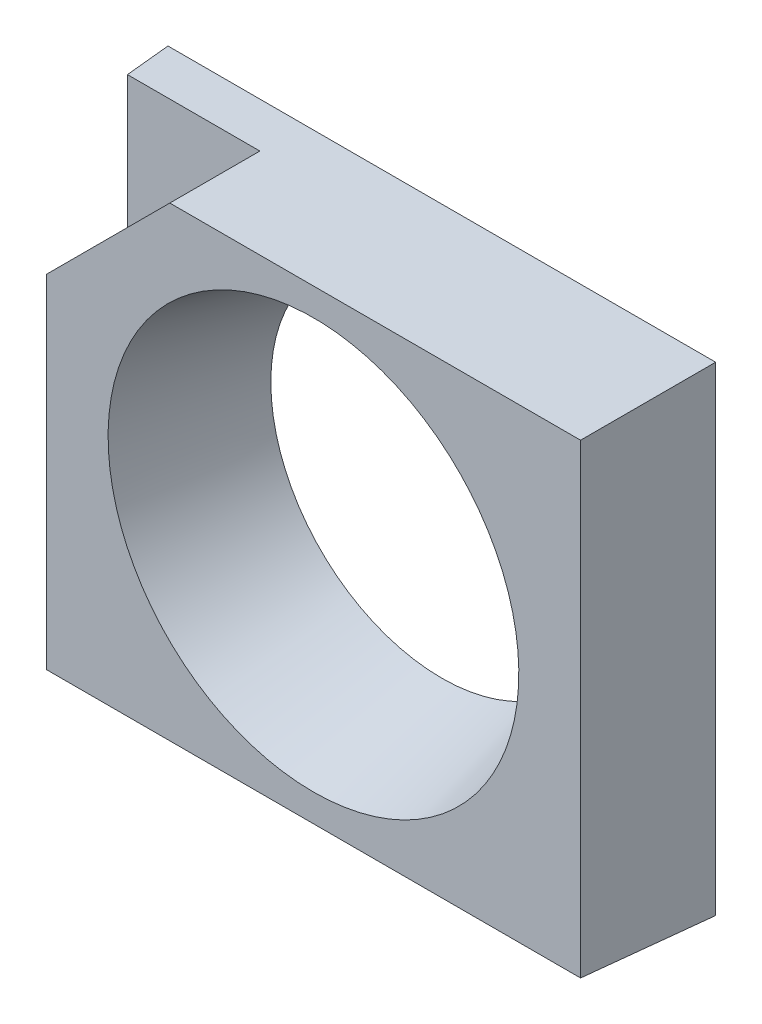
ISO-10303-21;
HEADER;
FILE_DESCRIPTION(('STEP AP214'),'2;1');
FILE_NAME('part.step','',(''),(''),'','','');
FILE_SCHEMA(('AUTOMOTIVE_DESIGN { 1 0 10303 214 1 1 1 1 }'));
ENDSEC;
DATA;
#1=APPLICATION_CONTEXT('core data for automotive mechanical design processes');
#2=APPLICATION_PROTOCOL_DEFINITION('international standard','automotive_design',2000,#1);
#3=PRODUCT_CONTEXT('',#1,'mechanical');
#4=PRODUCT('Part','Part','',(#3));
#5=PRODUCT_RELATED_PRODUCT_CATEGORY('part','',(#4));
#6=PRODUCT_DEFINITION_FORMATION('','',#4);
#7=PRODUCT_DEFINITION_CONTEXT('part definition',#1,'design');
#8=PRODUCT_DEFINITION('design','',#6,#7);
#9=PRODUCT_DEFINITION_SHAPE('','',#8);
#10=(LENGTH_UNIT() NAMED_UNIT(*) SI_UNIT(.MILLI.,.METRE.));
#11=(NAMED_UNIT(*) PLANE_ANGLE_UNIT() SI_UNIT($,.RADIAN.));
#12=(NAMED_UNIT(*) SI_UNIT($,.STERADIAN.) SOLID_ANGLE_UNIT());
#13=UNCERTAINTY_MEASURE_WITH_UNIT(LENGTH_MEASURE(1.E-05),#10,'distance_accuracy_value','');
#14=(GEOMETRIC_REPRESENTATION_CONTEXT(3) GLOBAL_UNCERTAINTY_ASSIGNED_CONTEXT((#13)) GLOBAL_UNIT_ASSIGNED_CONTEXT((#10,
#11,#12)) REPRESENTATION_CONTEXT('',''));
#15=CARTESIAN_POINT('',(0.,0.,0.));
#16=DIRECTION('',(0.,0.,1.));
#17=DIRECTION('',(1.,0.,0.));
#18=AXIS2_PLACEMENT_3D('',#15,#16,#17);
#19=CARTESIAN_POINT('',(-0.8,1.4,1.4));
#20=DIRECTION('',(-0.707106781186548,0.707106781186548,0.));
#21=DIRECTION('',(-0.707106781186548,-0.707106781186548,0.));
#22=AXIS2_PLACEMENT_3D('',#19,#20,#21);
#23=PLANE('',#22);
#24=DIRECTION('',(-0.0522644276876815,-0.0522644276886907,0.997264688634293));
#25=VECTOR('',#24,1.);
#26=CARTESIAN_POINT('',(-0.813101944821,1.38689805517925,1.40000000000001));
#27=LINE('',#26,#25);
#28=CARTESIAN_POINT('',(-0.813101944821,1.38689805517906,1.4));
#29=VERTEX_POINT('',#28);
#30=CARTESIAN_POINT('',(-0.839305834462,1.36069416553793,1.9));
#31=VERTEX_POINT('',#30);
#32=EDGE_CURVE('E66',#29,#31,#27,.T.);
#33=ORIENTED_EDGE('',*,*,#32,.F.);
#34=DIRECTION('',(-0.707106781186547,-0.707106781186547,0.));
#35=VECTOR('',#34,1.);
#36=CARTESIAN_POINT('',(-0.813101944821,1.386898055179,1.4));
#37=LINE('',#36,#35);
#38=CARTESIAN_POINT('',(-1.58689805517906,0.613101944821,1.4));
#39=VERTEX_POINT('',#38);
#40=EDGE_CURVE('E85',#29,#39,#37,.T.);
#41=ORIENTED_EDGE('',*,*,#40,.T.);
#42=DIRECTION('',(-0.0522644276886907,-0.0522644276876812,-0.997264688634293));
#43=VECTOR('',#42,1.);
#44=CARTESIAN_POINT('',(-1.56069416553774,0.639305834462,1.89999999999999));
#45=LINE('',#44,#43);
#46=CARTESIAN_POINT('',(-1.56069416553794,0.639305834462,1.9));
#47=VERTEX_POINT('',#46);
#48=EDGE_CURVE('E80',#47,#39,#45,.T.);
#49=ORIENTED_EDGE('',*,*,#48,.F.);
#50=DIRECTION('',(-0.707106781186547,-0.707106781186548,0.));
#51=VECTOR('',#50,1.);
#52=CARTESIAN_POINT('',(-0.839305834462,1.360694165538,1.9));
#53=LINE('',#52,#51);
#54=EDGE_CURVE('E79',#31,#47,#53,.T.);
#55=ORIENTED_EDGE('',*,*,#54,.F.);
#56=EDGE_LOOP('',(#33,#41,#49,#55));
#57=FACE_BOUND('',#56,.T.);
#58=ADVANCED_FACE('F17',(#57),#23,.T.);
#59=CARTESIAN_POINT('',(-1.6,0.6,1.4));
#60=DIRECTION('',(0.,0.,-1.));
#61=DIRECTION('',(-1.,0.,0.));
#62=AXIS2_PLACEMENT_3D('',#59,#60,#61);
#63=PLANE('',#62);
#64=DIRECTION('',(1.,0.,0.));
#65=VECTOR('',#64,1.);
#66=CARTESIAN_POINT('',(0.,1.38689805517925,1.40000000000001));
#67=LINE('',#66,#65);
#68=CARTESIAN_POINT('',(-1.58689805517906,1.38689805517906,1.40000000000001));
#69=VERTEX_POINT('',#68);
#70=EDGE_CURVE('E73',#69,#29,#67,.T.);
#71=ORIENTED_EDGE('',*,*,#70,.F.);
#72=DIRECTION('',(0.,1.,0.));
#73=VECTOR('',#72,1.);
#74=CARTESIAN_POINT('',(-1.58689805517925,0.,1.40000000000001));
#75=LINE('',#74,#73);
#76=EDGE_CURVE('E103',#39,#69,#75,.T.);
#77=ORIENTED_EDGE('',*,*,#76,.F.);
#78=ORIENTED_EDGE('',*,*,#40,.F.);
#79=EDGE_LOOP('',(#71,#77,#78));
#80=FACE_BOUND('',#79,.T.);
#81=ADVANCED_FACE('F104',(#80),#63,.F.);
#82=CARTESIAN_POINT('',(-1.6,-1.4,1.9));
#83=DIRECTION('',(0.,0.,1.));
#84=DIRECTION('',(1.,0.,0.));
#85=AXIS2_PLACEMENT_3D('',#82,#83,#84);
#86=PLANE('',#85);
#87=DIRECTION('',(1.,0.,0.));
#88=VECTOR('',#87,1.);
#89=CARTESIAN_POINT('',(0.,-1.36069416553774,1.89999999999999));
#90=LINE('',#89,#88);
#91=CARTESIAN_POINT('',(1.56069416553793,-1.36069416553793,1.89999999999999));
#92=VERTEX_POINT('',#91);
#93=CARTESIAN_POINT('',(-1.56069416553793,-1.36069416553787,1.89999999999999));
#94=VERTEX_POINT('',#93);
#95=EDGE_CURVE('E84',#92,#94,#90,.F.);
#96=ORIENTED_EDGE('',*,*,#95,.F.);
#97=DIRECTION('',(0.,1.,0.));
#98=VECTOR('',#97,1.);
#99=CARTESIAN_POINT('',(1.56069416553774,0.,1.89999999999999));
#100=LINE('',#99,#98);
#101=CARTESIAN_POINT('',(1.56069416553793,1.36069416553793,1.89999999999999));
#102=VERTEX_POINT('',#101);
#103=EDGE_CURVE('E91',#102,#92,#100,.F.);
#104=ORIENTED_EDGE('',*,*,#103,.F.);
#105=DIRECTION('',(1.,0.,0.));
#106=VECTOR('',#105,1.);
#107=CARTESIAN_POINT('',(0.,1.36069416553774,1.89999999999999));
#108=LINE('',#107,#106);
#109=EDGE_CURVE('E70',#31,#102,#108,.T.);
#110=ORIENTED_EDGE('',*,*,#109,.F.);
#111=ORIENTED_EDGE('',*,*,#54,.T.);
#112=DIRECTION('',(0.,1.,0.));
#113=VECTOR('',#112,1.);
#114=CARTESIAN_POINT('',(-1.56069416553774,0.,1.89999999999999));
#115=LINE('',#114,#113);
#116=EDGE_CURVE('E112',#94,#47,#115,.T.);
#117=ORIENTED_EDGE('',*,*,#116,.F.);
#118=EDGE_LOOP('',(#96,#104,#110,#111,#117));
#119=FACE_BOUND('',#118,.T.);
#120=CARTESIAN_POINT('',(0.,0.,1.89999999997781));
#121=DIRECTION('',(0.,0.,1.));
#122=DIRECTION('',(0.,-1.,0.));
#123=AXIS2_PLACEMENT_3D('',#120,#121,#122);
#124=CIRCLE('',#123,1.20000000004188);
#125=CARTESIAN_POINT('',(0.,-1.20000000004188,1.89999999997781));
#126=VERTEX_POINT('',#125);
#127=EDGE_CURVE('E20',#126,#126,#124,.F.);
#128=ORIENTED_EDGE('',*,*,#127,.T.);
#129=EDGE_LOOP('',(#128));
#130=FACE_BOUND('',#129,.T.);
#131=ADVANCED_FACE('F88',(#119,#130),#86,.T.);
#132=CARTESIAN_POINT('',(0.,-1.4,1.15));
#133=DIRECTION('',(0.,-0.998629534754575,0.0523359562429177));
#134=DIRECTION('',(0.,-0.0523359562429177,-0.998629534754575));
#135=AXIS2_PLACEMENT_3D('',#132,#133,#134);
#136=PLANE('',#135);
#137=ORIENTED_EDGE('',*,*,#95,.T.);
#138=DIRECTION('',(0.0522644276886888,0.0522644276883422,0.997264688634258));
#139=VECTOR('',#138,1.);
#140=CARTESIAN_POINT('',(-1.6,-1.4,1.15));
#141=LINE('',#140,#139);
#142=CARTESIAN_POINT('',(-1.6,-1.4,1.15));
#143=VERTEX_POINT('',#142);
#144=EDGE_CURVE('E106',#143,#94,#141,.T.);
#145=ORIENTED_EDGE('',*,*,#144,.F.);
#146=DIRECTION('',(1.,0.,0.));
#147=VECTOR('',#146,1.);
#148=CARTESIAN_POINT('',(-1.6,-1.4,1.15));
#149=LINE('',#148,#147);
#150=CARTESIAN_POINT('',(1.6,-1.4,1.15));
#151=VERTEX_POINT('',#150);
#152=EDGE_CURVE('E114',#143,#151,#149,.T.);
#153=ORIENTED_EDGE('',*,*,#152,.T.);
#154=DIRECTION('',(0.0522644276886888,-0.0522644276883422,-0.997264688634258));
#155=VECTOR('',#154,1.);
#156=CARTESIAN_POINT('',(1.56069416553774,-1.360694165538,1.89999999999999));
#157=LINE('',#156,#155);
#158=EDGE_CURVE('E76',#92,#151,#157,.T.);
#159=ORIENTED_EDGE('',*,*,#158,.F.);
#160=EDGE_LOOP('',(#137,#145,#153,#159));
#161=FACE_BOUND('',#160,.T.);
#162=ADVANCED_FACE('F133',(#161),#136,.T.);
#163=CARTESIAN_POINT('',(1.6,0.,1.15));
#164=DIRECTION('',(0.998629534754575,0.,0.0523359562429177));
#165=DIRECTION('',(0.0523359562429177,0.,-0.998629534754575));
#166=AXIS2_PLACEMENT_3D('',#163,#164,#165);
#167=PLANE('',#166);
#168=ORIENTED_EDGE('',*,*,#103,.T.);
#169=ORIENTED_EDGE('',*,*,#158,.T.);
#170=DIRECTION('',(0.,1.,0.));
#171=VECTOR('',#170,1.);
#172=CARTESIAN_POINT('',(1.6,-1.4,1.15));
#173=LINE('',#172,#171);
#174=CARTESIAN_POINT('',(1.6,1.4,1.15));
#175=VERTEX_POINT('',#174);
#176=EDGE_CURVE('E117',#151,#175,#173,.T.);
#177=ORIENTED_EDGE('',*,*,#176,.T.);
#178=DIRECTION('',(0.0522644276883425,0.0522644276886888,-0.997264688634258));
#179=VECTOR('',#178,1.);
#180=CARTESIAN_POINT('',(1.560694165538,1.36069416553774,1.89999999999999));
#181=LINE('',#180,#179);
#182=EDGE_CURVE('E93',#102,#175,#181,.T.);
#183=ORIENTED_EDGE('',*,*,#182,.F.);
#184=EDGE_LOOP('',(#168,#169,#177,#183));
#185=FACE_BOUND('',#184,.T.);
#186=ADVANCED_FACE('F130',(#185),#167,.T.);
#187=CARTESIAN_POINT('',(0.,1.4,1.15));
#188=DIRECTION('',(0.,0.998629534754575,0.0523359562429177));
#189=DIRECTION('',(0.,-0.0523359562429177,0.998629534754575));
#190=AXIS2_PLACEMENT_3D('',#187,#188,#189);
#191=PLANE('',#190);
#192=DIRECTION('',(-0.052264427688685,0.052264427689665,-0.997264688634189));
#193=VECTOR('',#192,1.);
#194=CARTESIAN_POINT('',(-1.58689805517925,1.386898055179,1.40000000000001));
#195=LINE('',#194,#193);
#196=CARTESIAN_POINT('',(-1.6,1.4,1.15));
#197=VERTEX_POINT('',#196);
#198=EDGE_CURVE('E34',#69,#197,#195,.T.);
#199=ORIENTED_EDGE('',*,*,#198,.F.);
#200=ORIENTED_EDGE('',*,*,#70,.T.);
#201=ORIENTED_EDGE('',*,*,#32,.T.);
#202=ORIENTED_EDGE('',*,*,#109,.T.);
#203=ORIENTED_EDGE('',*,*,#182,.T.);
#204=DIRECTION('',(1.,0.,0.));
#205=VECTOR('',#204,1.);
#206=CARTESIAN_POINT('',(-1.6,1.4,1.15));
#207=LINE('',#206,#205);
#208=EDGE_CURVE('E120',#175,#197,#207,.F.);
#209=ORIENTED_EDGE('',*,*,#208,.T.);
#210=EDGE_LOOP('',(#199,#200,#201,#202,#203,#209));
#211=FACE_BOUND('',#210,.T.);
#212=ADVANCED_FACE('F68',(#211),#191,.T.);
#213=CARTESIAN_POINT('',(-1.6,0.,1.15));
#214=DIRECTION('',(-0.998629534754575,0.,0.0523359562429177));
#215=DIRECTION('',(0.0523359562429177,0.,0.998629534754575));
#216=AXIS2_PLACEMENT_3D('',#213,#214,#215);
#217=PLANE('',#216);
#218=ORIENTED_EDGE('',*,*,#144,.T.);
#219=ORIENTED_EDGE('',*,*,#116,.T.);
#220=ORIENTED_EDGE('',*,*,#48,.T.);
#221=ORIENTED_EDGE('',*,*,#76,.T.);
#222=ORIENTED_EDGE('',*,*,#198,.T.);
#223=DIRECTION('',(0.,1.,0.));
#224=VECTOR('',#223,1.);
#225=CARTESIAN_POINT('',(-1.6,-1.4,1.15));
#226=LINE('',#225,#224);
#227=EDGE_CURVE('E26',#197,#143,#226,.F.);
#228=ORIENTED_EDGE('',*,*,#227,.T.);
#229=EDGE_LOOP('',(#218,#219,#220,#221,#222,#228));
#230=FACE_BOUND('',#229,.T.);
#231=ADVANCED_FACE('F123',(#230),#217,.T.);
#232=CARTESIAN_POINT('',(0.,0.,1.89999999986412));
#233=DIRECTION('',(0.,0.,1.));
#234=DIRECTION('',(0.,-1.,0.));
#235=AXIS2_PLACEMENT_3D('',#232,#233,#234);
#236=CONICAL_SURFACE('',#235,1.20000000001141,0.261799387821007);
#237=ORIENTED_EDGE('',*,*,#127,.F.);
#238=EDGE_LOOP('',(#237));
#239=FACE_BOUND('',#238,.T.);
#240=CARTESIAN_POINT('',(0.,0.,1.14999999999554));
#241=DIRECTION('',(0.,0.,1.));
#242=DIRECTION('',(0.,-1.,0.));
#243=AXIS2_PLACEMENT_3D('',#240,#241,#242);
#244=CIRCLE('',#243,0.999038105705716);
#245=CARTESIAN_POINT('',(0.,-0.999038105705716,1.14999999999554));
#246=VERTEX_POINT('',#245);
#247=EDGE_CURVE('E11',#246,#246,#244,.F.);
#248=ORIENTED_EDGE('',*,*,#247,.T.);
#249=EDGE_LOOP('',(#248));
#250=FACE_BOUND('',#249,.T.);
#251=ADVANCED_FACE('F144',(#239,#250),#236,.F.);
#252=CARTESIAN_POINT('',(-1.6,-1.4,1.15));
#253=DIRECTION('',(0.,0.,1.));
#254=DIRECTION('',(1.,0.,0.));
#255=AXIS2_PLACEMENT_3D('',#252,#253,#254);
#256=PLANE('',#255);
#257=ORIENTED_EDGE('',*,*,#247,.F.);
#258=EDGE_LOOP('',(#257));
#259=FACE_BOUND('',#258,.T.);
#260=ORIENTED_EDGE('',*,*,#208,.F.);
#261=ORIENTED_EDGE('',*,*,#176,.F.);
#262=ORIENTED_EDGE('',*,*,#152,.F.);
#263=ORIENTED_EDGE('',*,*,#227,.F.);
#264=EDGE_LOOP('',(#260,#261,#262,#263));
#265=FACE_BOUND('',#264,.T.);
#266=ADVANCED_FACE('F127',(#259,#265),#256,.F.);
#267=CLOSED_SHELL('',(#58,#81,#131,#162,#186,#212,#231,#251,#266));
#268=MANIFOLD_SOLID_BREP('B1',#267);
#269=ADVANCED_BREP_SHAPE_REPRESENTATION('',(#18,#268),#14);
#270=SHAPE_DEFINITION_REPRESENTATION(#9,#269);
ENDSEC;
END-ISO-10303-21;
